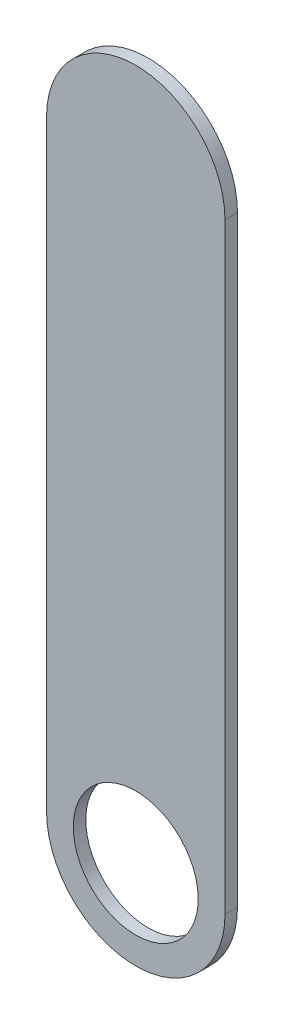
ISO-10303-21;
HEADER;
FILE_DESCRIPTION(('STEP AP214'),'2;1');
FILE_NAME('part.step','',(''),(''),'','','');
FILE_SCHEMA(('AUTOMOTIVE_DESIGN { 1 0 10303 214 1 1 1 1 }'));
ENDSEC;
DATA;
#1=APPLICATION_CONTEXT('core data for automotive mechanical design processes');
#2=APPLICATION_PROTOCOL_DEFINITION('international standard','automotive_design',2000,#1);
#3=PRODUCT_CONTEXT('',#1,'mechanical');
#4=PRODUCT('Part','Part','',(#3));
#5=PRODUCT_RELATED_PRODUCT_CATEGORY('part','',(#4));
#6=PRODUCT_DEFINITION_FORMATION('','',#4);
#7=PRODUCT_DEFINITION_CONTEXT('part definition',#1,'design');
#8=PRODUCT_DEFINITION('design','',#6,#7);
#9=PRODUCT_DEFINITION_SHAPE('','',#8);
#10=(LENGTH_UNIT() NAMED_UNIT(*) SI_UNIT(.MILLI.,.METRE.));
#11=(NAMED_UNIT(*) PLANE_ANGLE_UNIT() SI_UNIT($,.RADIAN.));
#12=(NAMED_UNIT(*) SI_UNIT($,.STERADIAN.) SOLID_ANGLE_UNIT());
#13=UNCERTAINTY_MEASURE_WITH_UNIT(LENGTH_MEASURE(1.E-05),#10,'distance_accuracy_value','');
#14=(GEOMETRIC_REPRESENTATION_CONTEXT(3) GLOBAL_UNCERTAINTY_ASSIGNED_CONTEXT((#13)) GLOBAL_UNIT_ASSIGNED_CONTEXT((#10,
#11,#12)) REPRESENTATION_CONTEXT('',''));
#15=CARTESIAN_POINT('',(0.,0.,0.));
#16=DIRECTION('',(0.,0.,1.));
#17=DIRECTION('',(1.,0.,0.));
#18=AXIS2_PLACEMENT_3D('',#15,#16,#17);
#19=CARTESIAN_POINT('',(111.5,-123.,-0.045));
#20=DIRECTION('',(0.,0.,-1.));
#21=DIRECTION('',(0.,-1.,0.));
#22=AXIS2_PLACEMENT_3D('',#19,#20,#21);
#23=CYLINDRICAL_SURFACE('',#22,0.175);
#24=CARTESIAN_POINT('',(111.5,-123.,1.6));
#25=DIRECTION('',(0.,0.,-1.));
#26=DIRECTION('',(0.,-1.,0.));
#27=AXIS2_PLACEMENT_3D('',#24,#25,#26);
#28=CIRCLE('',#27,0.175);
#29=CARTESIAN_POINT('',(111.5,-123.175,1.6));
#30=VERTEX_POINT('',#29);
#31=EDGE_CURVE('E121',#30,#30,#28,.T.);
#32=ORIENTED_EDGE('',*,*,#31,.T.);
#33=DIRECTION('',(0.,0.,1.));
#34=VECTOR('',#33,1.);
#35=CARTESIAN_POINT('',(111.5,-123.175,-0.045));
#36=LINE('',#35,#34);
#37=CARTESIAN_POINT('',(111.5,-123.175,1.635));
#38=VERTEX_POINT('',#37);
#39=EDGE_CURVE('E11',#30,#38,#36,.T.);
#40=ORIENTED_EDGE('',*,*,#39,.T.);
#41=CARTESIAN_POINT('',(111.5,-123.,1.635));
#42=DIRECTION('',(0.,0.,-1.));
#43=DIRECTION('',(0.,-1.,0.));
#44=AXIS2_PLACEMENT_3D('',#41,#42,#43);
#45=CIRCLE('',#44,0.175);
#46=EDGE_CURVE('E26',#38,#38,#45,.T.);
#47=ORIENTED_EDGE('',*,*,#46,.F.);
#48=ORIENTED_EDGE('',*,*,#39,.F.);
#49=EDGE_LOOP('',(#32,#40,#47,#48));
#50=FACE_BOUND('',#49,.T.);
#51=ADVANCED_FACE('F17',(#50),#23,.F.);
#52=CARTESIAN_POINT('',(111.75,-123.,1.6));
#53=DIRECTION('',(-1.,0.,0.));
#54=DIRECTION('',(0.,0.,1.));
#55=AXIS2_PLACEMENT_3D('',#52,#53,#54);
#56=PLANE('',#55);
#57=DIRECTION('',(0.,1.,0.));
#58=VECTOR('',#57,1.);
#59=CARTESIAN_POINT('',(111.75,-123.,1.6));
#60=LINE('',#59,#58);
#61=CARTESIAN_POINT('',(111.75,-123.,1.6));
#62=VERTEX_POINT('',#61);
#63=CARTESIAN_POINT('',(111.75,-121.314,1.6));
#64=VERTEX_POINT('',#63);
#65=EDGE_CURVE('E110',#62,#64,#60,.T.);
#66=ORIENTED_EDGE('',*,*,#65,.T.);
#67=DIRECTION('',(0.,0.,1.));
#68=VECTOR('',#67,1.);
#69=CARTESIAN_POINT('',(111.75,-121.314,1.6));
#70=LINE('',#69,#68);
#71=CARTESIAN_POINT('',(111.75,-121.314,1.635));
#72=VERTEX_POINT('',#71);
#73=EDGE_CURVE('E80',#64,#72,#70,.T.);
#74=ORIENTED_EDGE('',*,*,#73,.T.);
#75=DIRECTION('',(0.,1.,0.));
#76=VECTOR('',#75,1.);
#77=CARTESIAN_POINT('',(111.75,-123.,1.635));
#78=LINE('',#77,#76);
#79=CARTESIAN_POINT('',(111.75,-123.,1.635));
#80=VERTEX_POINT('',#79);
#81=EDGE_CURVE('E118',#80,#72,#78,.T.);
#82=ORIENTED_EDGE('',*,*,#81,.F.);
#83=DIRECTION('',(0.,0.,1.));
#84=VECTOR('',#83,1.);
#85=CARTESIAN_POINT('',(111.75,-123.,1.6));
#86=LINE('',#85,#84);
#87=EDGE_CURVE('E115',#62,#80,#86,.T.);
#88=ORIENTED_EDGE('',*,*,#87,.F.);
#89=EDGE_LOOP('',(#66,#74,#82,#88));
#90=FACE_BOUND('',#89,.T.);
#91=ADVANCED_FACE('F139',(#90),#56,.F.);
#92=CARTESIAN_POINT('',(111.25,-121.314,1.635));
#93=DIRECTION('',(0.,0.,1.));
#94=DIRECTION('',(1.,0.,0.));
#95=AXIS2_PLACEMENT_3D('',#92,#93,#94);
#96=PLANE('',#95);
#97=ORIENTED_EDGE('',*,*,#46,.T.);
#98=EDGE_LOOP('',(#97));
#99=FACE_BOUND('',#98,.T.);
#100=DIRECTION('',(0.,-1.,0.));
#101=VECTOR('',#100,1.);
#102=CARTESIAN_POINT('',(111.25,-121.314,1.635));
#103=LINE('',#102,#101);
#104=CARTESIAN_POINT('',(111.25,-121.314,1.635));
#105=VERTEX_POINT('',#104);
#106=CARTESIAN_POINT('',(111.25,-123.,1.635));
#107=VERTEX_POINT('',#106);
#108=EDGE_CURVE('E93',#105,#107,#103,.T.);
#109=ORIENTED_EDGE('',*,*,#108,.T.);
#110=CARTESIAN_POINT('',(111.5,-123.,1.635));
#111=DIRECTION('',(0.,0.,1.));
#112=DIRECTION('',(-1.,0.,0.));
#113=AXIS2_PLACEMENT_3D('',#110,#111,#112);
#114=CIRCLE('',#113,0.25);
#115=EDGE_CURVE('E111',#107,#80,#114,.T.);
#116=ORIENTED_EDGE('',*,*,#115,.T.);
#117=ORIENTED_EDGE('',*,*,#81,.T.);
#118=CARTESIAN_POINT('',(111.5,-121.314,1.635));
#119=DIRECTION('',(0.,0.,1.));
#120=DIRECTION('',(1.,0.,0.));
#121=AXIS2_PLACEMENT_3D('',#118,#119,#120);
#122=CIRCLE('',#121,0.25);
#123=EDGE_CURVE('E85',#72,#105,#122,.T.);
#124=ORIENTED_EDGE('',*,*,#123,.T.);
#125=EDGE_LOOP('',(#109,#116,#117,#124));
#126=FACE_BOUND('',#125,.T.);
#127=ADVANCED_FACE('F213',(#99,#126),#96,.T.);
#128=CARTESIAN_POINT('',(111.25,-121.314,1.6));
#129=DIRECTION('',(0.,0.,1.));
#130=DIRECTION('',(1.,0.,0.));
#131=AXIS2_PLACEMENT_3D('',#128,#129,#130);
#132=PLANE('',#131);
#133=ORIENTED_EDGE('',*,*,#31,.F.);
#134=EDGE_LOOP('',(#133));
#135=FACE_BOUND('',#134,.T.);
#136=CARTESIAN_POINT('',(111.5,-121.314,1.6));
#137=DIRECTION('',(0.,0.,1.));
#138=DIRECTION('',(1.,0.,0.));
#139=AXIS2_PLACEMENT_3D('',#136,#137,#138);
#140=CIRCLE('',#139,0.25);
#141=CARTESIAN_POINT('',(111.25,-121.314,1.6));
#142=VERTEX_POINT('',#141);
#143=EDGE_CURVE('E73',#64,#142,#140,.T.);
#144=ORIENTED_EDGE('',*,*,#143,.F.);
#145=ORIENTED_EDGE('',*,*,#65,.F.);
#146=CARTESIAN_POINT('',(111.5,-123.,1.6));
#147=DIRECTION('',(0.,0.,1.));
#148=DIRECTION('',(-1.,0.,0.));
#149=AXIS2_PLACEMENT_3D('',#146,#147,#148);
#150=CIRCLE('',#149,0.25);
#151=CARTESIAN_POINT('',(111.25,-123.,1.6));
#152=VERTEX_POINT('',#151);
#153=EDGE_CURVE('E98',#152,#62,#150,.T.);
#154=ORIENTED_EDGE('',*,*,#153,.F.);
#155=DIRECTION('',(0.,-1.,0.));
#156=VECTOR('',#155,1.);
#157=CARTESIAN_POINT('',(111.25,-121.314,1.6));
#158=LINE('',#157,#156);
#159=EDGE_CURVE('E91',#142,#152,#158,.T.);
#160=ORIENTED_EDGE('',*,*,#159,.F.);
#161=EDGE_LOOP('',(#144,#145,#154,#160));
#162=FACE_BOUND('',#161,.T.);
#163=ADVANCED_FACE('F96',(#135,#162),#132,.F.);
#164=CARTESIAN_POINT('',(111.5,-123.,1.6));
#165=DIRECTION('',(0.,0.,-1.));
#166=DIRECTION('',(-1.,0.,0.));
#167=AXIS2_PLACEMENT_3D('',#164,#165,#166);
#168=CYLINDRICAL_SURFACE('',#167,0.25);
#169=ORIENTED_EDGE('',*,*,#153,.T.);
#170=ORIENTED_EDGE('',*,*,#87,.T.);
#171=ORIENTED_EDGE('',*,*,#115,.F.);
#172=DIRECTION('',(0.,0.,1.));
#173=VECTOR('',#172,1.);
#174=CARTESIAN_POINT('',(111.25,-123.,1.6));
#175=LINE('',#174,#173);
#176=EDGE_CURVE('E101',#152,#107,#175,.T.);
#177=ORIENTED_EDGE('',*,*,#176,.F.);
#178=EDGE_LOOP('',(#169,#170,#171,#177));
#179=FACE_BOUND('',#178,.T.);
#180=ADVANCED_FACE('F137',(#179),#168,.T.);
#181=CARTESIAN_POINT('',(111.5,-121.314,1.6));
#182=DIRECTION('',(0.,0.,-1.));
#183=DIRECTION('',(1.,0.,0.));
#184=AXIS2_PLACEMENT_3D('',#181,#182,#183);
#185=CYLINDRICAL_SURFACE('',#184,0.25);
#186=ORIENTED_EDGE('',*,*,#143,.T.);
#187=DIRECTION('',(0.,0.,1.));
#188=VECTOR('',#187,1.);
#189=CARTESIAN_POINT('',(111.25,-121.314,1.6));
#190=LINE('',#189,#188);
#191=EDGE_CURVE('E77',#142,#105,#190,.T.);
#192=ORIENTED_EDGE('',*,*,#191,.T.);
#193=ORIENTED_EDGE('',*,*,#123,.F.);
#194=ORIENTED_EDGE('',*,*,#73,.F.);
#195=EDGE_LOOP('',(#186,#192,#193,#194));
#196=FACE_BOUND('',#195,.T.);
#197=ADVANCED_FACE('F75',(#196),#185,.T.);
#198=CARTESIAN_POINT('',(111.25,-121.314,1.6));
#199=DIRECTION('',(1.,0.,0.));
#200=DIRECTION('',(0.,1.,0.));
#201=AXIS2_PLACEMENT_3D('',#198,#199,#200);
#202=PLANE('',#201);
#203=ORIENTED_EDGE('',*,*,#159,.T.);
#204=ORIENTED_EDGE('',*,*,#176,.T.);
#205=ORIENTED_EDGE('',*,*,#108,.F.);
#206=ORIENTED_EDGE('',*,*,#191,.F.);
#207=EDGE_LOOP('',(#203,#204,#205,#206));
#208=FACE_BOUND('',#207,.T.);
#209=ADVANCED_FACE('F89',(#208),#202,.F.);
#210=CLOSED_SHELL('',(#51,#91,#127,#163,#180,#197,#209));
#211=MANIFOLD_SOLID_BREP('B1',#210);
#212=ADVANCED_BREP_SHAPE_REPRESENTATION('',(#18,#211),#14);
#213=SHAPE_DEFINITION_REPRESENTATION(#9,#212);
ENDSEC;
END-ISO-10303-21;
